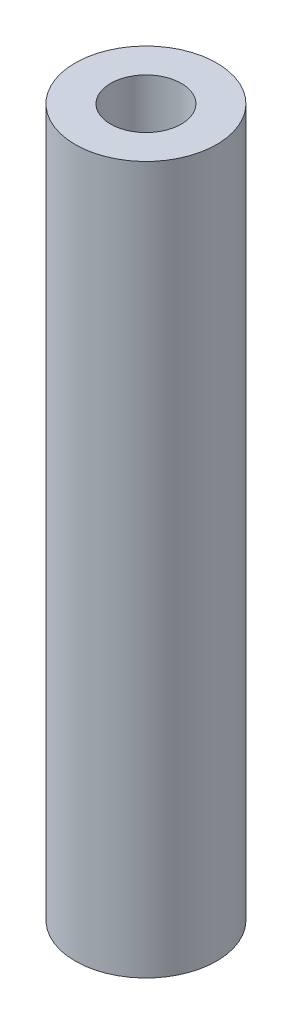
ISO-10303-21;
HEADER;
FILE_DESCRIPTION(('STEP AP214'),'2;1');
FILE_NAME('part.step','',(''),(''),'','','');
FILE_SCHEMA(('AUTOMOTIVE_DESIGN { 1 0 10303 214 1 1 1 1 }'));
ENDSEC;
DATA;
#1=APPLICATION_CONTEXT('core data for automotive mechanical design processes');
#2=APPLICATION_PROTOCOL_DEFINITION('international standard','automotive_design',2000,#1);
#3=PRODUCT_CONTEXT('',#1,'mechanical');
#4=PRODUCT('Part','Part','',(#3));
#5=PRODUCT_RELATED_PRODUCT_CATEGORY('part','',(#4));
#6=PRODUCT_DEFINITION_FORMATION('','',#4);
#7=PRODUCT_DEFINITION_CONTEXT('part definition',#1,'design');
#8=PRODUCT_DEFINITION('design','',#6,#7);
#9=PRODUCT_DEFINITION_SHAPE('','',#8);
#10=(LENGTH_UNIT() NAMED_UNIT(*) SI_UNIT(.MILLI.,.METRE.));
#11=(NAMED_UNIT(*) PLANE_ANGLE_UNIT() SI_UNIT($,.RADIAN.));
#12=(NAMED_UNIT(*) SI_UNIT($,.STERADIAN.) SOLID_ANGLE_UNIT());
#13=UNCERTAINTY_MEASURE_WITH_UNIT(LENGTH_MEASURE(1.E-05),#10,'distance_accuracy_value','');
#14=(GEOMETRIC_REPRESENTATION_CONTEXT(3) GLOBAL_UNCERTAINTY_ASSIGNED_CONTEXT((#13)) GLOBAL_UNIT_ASSIGNED_CONTEXT((#10,
#11,#12)) REPRESENTATION_CONTEXT('',''));
#15=CARTESIAN_POINT('',(0.,0.,0.));
#16=DIRECTION('',(0.,0.,1.));
#17=DIRECTION('',(1.,0.,0.));
#18=AXIS2_PLACEMENT_3D('',#15,#16,#17);
#19=CARTESIAN_POINT('',(0.,30.,0.));
#20=DIRECTION('',(0.,-1.,0.));
#21=DIRECTION('',(0.,0.,-1.));
#22=AXIS2_PLACEMENT_3D('',#19,#20,#21);
#23=CYLINDRICAL_SURFACE('',#22,3.);
#24=CARTESIAN_POINT('',(0.,30.,0.));
#25=DIRECTION('',(0.,1.,0.));
#26=DIRECTION('',(0.,0.,1.));
#27=AXIS2_PLACEMENT_3D('',#24,#25,#26);
#28=CIRCLE('',#27,3.);
#29=CARTESIAN_POINT('',(0.,30.,3.));
#30=VERTEX_POINT('',#29);
#31=EDGE_CURVE('E10',#30,#30,#28,.T.);
#32=ORIENTED_EDGE('',*,*,#31,.F.);
#33=EDGE_LOOP('',(#32));
#34=FACE_BOUND('',#33,.T.);
#35=CARTESIAN_POINT('',(0.,0.,0.));
#36=DIRECTION('',(0.,1.,0.));
#37=DIRECTION('',(0.,0.,1.));
#38=AXIS2_PLACEMENT_3D('',#35,#36,#37);
#39=CIRCLE('',#38,3.);
#40=CARTESIAN_POINT('',(0.,0.,3.));
#41=VERTEX_POINT('',#40);
#42=EDGE_CURVE('E40',#41,#41,#39,.T.);
#43=ORIENTED_EDGE('',*,*,#42,.T.);
#44=EDGE_LOOP('',(#43));
#45=FACE_BOUND('',#44,.T.);
#46=ADVANCED_FACE('F37',(#34,#45),#23,.T.);
#47=CARTESIAN_POINT('',(0.,30.,0.));
#48=DIRECTION('',(0.,1.,0.));
#49=DIRECTION('',(0.,0.,1.));
#50=AXIS2_PLACEMENT_3D('',#47,#48,#49);
#51=PLANE('',#50);
#52=CARTESIAN_POINT('',(0.,30.,0.));
#53=DIRECTION('',(0.,1.,0.));
#54=DIRECTION('',(0.,0.,1.));
#55=AXIS2_PLACEMENT_3D('',#52,#53,#54);
#56=CIRCLE('',#55,1.5);
#57=CARTESIAN_POINT('',(0.,30.,1.5));
#58=VERTEX_POINT('',#57);
#59=EDGE_CURVE('E49',#58,#58,#56,.T.);
#60=ORIENTED_EDGE('',*,*,#59,.F.);
#61=EDGE_LOOP('',(#60));
#62=FACE_BOUND('',#61,.T.);
#63=ORIENTED_EDGE('',*,*,#31,.T.);
#64=EDGE_LOOP('',(#63));
#65=FACE_BOUND('',#64,.T.);
#66=ADVANCED_FACE('F64',(#62,#65),#51,.T.);
#67=CARTESIAN_POINT('',(0.,0.,0.));
#68=DIRECTION('',(0.,1.,0.));
#69=DIRECTION('',(0.,0.,1.));
#70=AXIS2_PLACEMENT_3D('',#67,#68,#69);
#71=PLANE('',#70);
#72=ORIENTED_EDGE('',*,*,#42,.F.);
#73=EDGE_LOOP('',(#72));
#74=FACE_BOUND('',#73,.T.);
#75=ADVANCED_FACE('F60',(#74),#71,.F.);
#76=CARTESIAN_POINT('',(0.,24.,0.));
#77=DIRECTION('',(0.,1.,0.));
#78=DIRECTION('',(0.,0.,1.));
#79=AXIS2_PLACEMENT_3D('',#76,#77,#78);
#80=CYLINDRICAL_SURFACE('',#79,1.5);
#81=CARTESIAN_POINT('',(0.,24.,0.));
#82=DIRECTION('',(0.,1.,0.));
#83=DIRECTION('',(0.,0.,1.));
#84=AXIS2_PLACEMENT_3D('',#81,#82,#83);
#85=CIRCLE('',#84,1.5);
#86=CARTESIAN_POINT('',(0.,24.,1.5));
#87=VERTEX_POINT('',#86);
#88=EDGE_CURVE('E47',#87,#87,#85,.T.);
#89=ORIENTED_EDGE('',*,*,#88,.F.);
#90=EDGE_LOOP('',(#89));
#91=FACE_BOUND('',#90,.T.);
#92=ORIENTED_EDGE('',*,*,#59,.T.);
#93=EDGE_LOOP('',(#92));
#94=FACE_BOUND('',#93,.T.);
#95=ADVANCED_FACE('F57',(#91,#94),#80,.F.);
#96=CARTESIAN_POINT('',(0.,24.,0.));
#97=DIRECTION('',(0.,1.,0.));
#98=DIRECTION('',(0.,0.,1.));
#99=AXIS2_PLACEMENT_3D('',#96,#97,#98);
#100=PLANE('',#99);
#101=ORIENTED_EDGE('',*,*,#88,.T.);
#102=EDGE_LOOP('',(#101));
#103=FACE_BOUND('',#102,.T.);
#104=ADVANCED_FACE('F55',(#103),#100,.T.);
#105=CLOSED_SHELL('',(#46,#66,#75,#95,#104));
#106=MANIFOLD_SOLID_BREP('B2',#105);
#107=ADVANCED_BREP_SHAPE_REPRESENTATION('',(#18,#106),#14);
#108=SHAPE_DEFINITION_REPRESENTATION(#9,#107);
ENDSEC;
END-ISO-10303-21;
